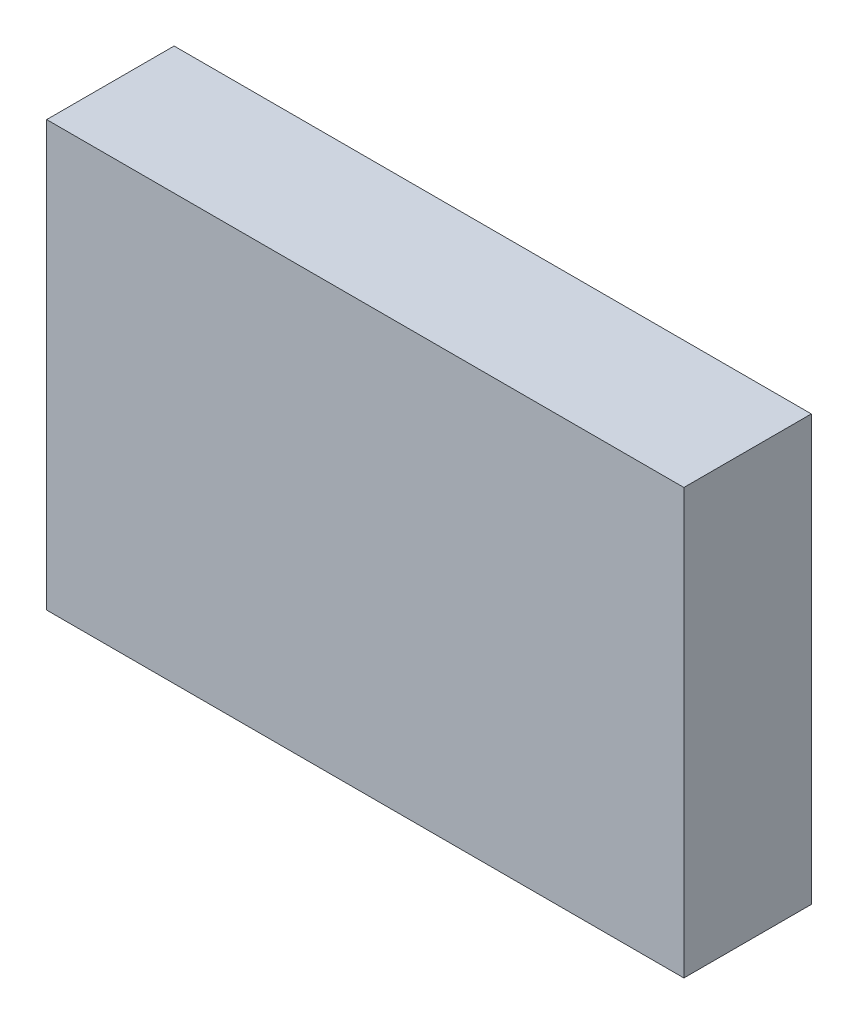
ISO-10303-21;
HEADER;
FILE_DESCRIPTION(('STEP AP214'),'2;1');
FILE_NAME('part.step','',(''),(''),'','','');
FILE_SCHEMA(('AUTOMOTIVE_DESIGN { 1 0 10303 214 1 1 1 1 }'));
ENDSEC;
DATA;
#1=APPLICATION_CONTEXT('core data for automotive mechanical design processes');
#2=APPLICATION_PROTOCOL_DEFINITION('international standard','automotive_design',2000,#1);
#3=PRODUCT_CONTEXT('',#1,'mechanical');
#4=PRODUCT('Part','Part','',(#3));
#5=PRODUCT_RELATED_PRODUCT_CATEGORY('part','',(#4));
#6=PRODUCT_DEFINITION_FORMATION('','',#4);
#7=PRODUCT_DEFINITION_CONTEXT('part definition',#1,'design');
#8=PRODUCT_DEFINITION('design','',#6,#7);
#9=PRODUCT_DEFINITION_SHAPE('','',#8);
#10=(LENGTH_UNIT() NAMED_UNIT(*) SI_UNIT(.MILLI.,.METRE.));
#11=(NAMED_UNIT(*) PLANE_ANGLE_UNIT() SI_UNIT($,.RADIAN.));
#12=(NAMED_UNIT(*) SI_UNIT($,.STERADIAN.) SOLID_ANGLE_UNIT());
#13=UNCERTAINTY_MEASURE_WITH_UNIT(LENGTH_MEASURE(1.E-05),#10,'distance_accuracy_value','');
#14=(GEOMETRIC_REPRESENTATION_CONTEXT(3) GLOBAL_UNCERTAINTY_ASSIGNED_CONTEXT((#13)) GLOBAL_UNIT_ASSIGNED_CONTEXT((#10,
#11,#12)) REPRESENTATION_CONTEXT('',''));
#15=CARTESIAN_POINT('',(0.,0.,0.));
#16=DIRECTION('',(0.,0.,1.));
#17=DIRECTION('',(1.,0.,0.));
#18=AXIS2_PLACEMENT_3D('',#15,#16,#17);
#19=CARTESIAN_POINT('',(23.4897837731481,6.69672301240758,-0.139997918412997));
#20=CARTESIAN_POINT('',(23.4897837731481,6.69672301240758,-0.859999526412997));
#21=CARTESIAN_POINT('',(23.4897837731481,9.09672126040757,-0.139997918412997));
#22=CARTESIAN_POINT('',(23.4897837731481,9.09672126040757,-0.859999526412997));
#23=(BOUNDED_SURFACE() B_SPLINE_SURFACE(1,1,((#19,#20),(#21,#22)),.UNSPECIFIED.,.F.,.F.,
.F.) B_SPLINE_SURFACE_WITH_KNOTS((2,2),(2,2),(-0.000199999853999999,0.00219999839399999),
(-0.000660001474,6.0000134E-05),
.UNSPECIFIED.) GEOMETRIC_REPRESENTATION_ITEM() RATIONAL_B_SPLINE_SURFACE(((1.,1.),(1.,1.))) REPRESENTATION_ITEM('') SURFACE());
#24=CARTESIAN_POINT('',(23.4897837731481,8.89672140640757,-0.799999392412997));
#25=CARTESIAN_POINT('',(23.4897837731481,6.89672286640758,-0.799999392412997));
#26=(BOUNDED_CURVE() B_SPLINE_CURVE(1,(#24,#25),.UNSPECIFIED.,.F.,
.F.) B_SPLINE_CURVE_WITH_KNOTS((2,2),(0.,0.00199999853999999),
.UNSPECIFIED.) CURVE() GEOMETRIC_REPRESENTATION_ITEM() RATIONAL_B_SPLINE_CURVE((1.,1.)) REPRESENTATION_ITEM(''));
#27=CARTESIAN_POINT('',(23.4897837731481,8.89672140640757,-0.799999392412997));
#28=VERTEX_POINT('',#27);
#29=CARTESIAN_POINT('',(23.4897837731481,6.89672286640758,-0.799999392412997));
#30=VERTEX_POINT('',#29);
#31=EDGE_CURVE('E87',#28,#30,#26,.T.);
#32=CARTESIAN_POINT('',(23.4897837731481,6.89672286640758,-0.799999392412997));
#33=CARTESIAN_POINT('',(23.4897837731481,6.89672286640758,-0.199998052412997));
#34=(BOUNDED_CURVE() B_SPLINE_CURVE(1,(#32,#33),.UNSPECIFIED.,.F.,
.F.) B_SPLINE_CURVE_WITH_KNOTS((2,2),(0.,0.00060000134),
.UNSPECIFIED.) CURVE() GEOMETRIC_REPRESENTATION_ITEM() RATIONAL_B_SPLINE_CURVE((1.,1.)) REPRESENTATION_ITEM(''));
#35=CARTESIAN_POINT('',(23.4897837731481,6.89672286640758,-0.199998052412997));
#36=VERTEX_POINT('',#35);
#37=EDGE_CURVE('E11',#30,#36,#34,.T.);
#38=CARTESIAN_POINT('',(23.4897837731481,8.89672140640757,-0.199998052412997));
#39=CARTESIAN_POINT('',(23.4897837731481,6.89672286640758,-0.199998052412997));
#40=(BOUNDED_CURVE() B_SPLINE_CURVE(1,(#38,#39),.UNSPECIFIED.,.F.,
.F.) B_SPLINE_CURVE_WITH_KNOTS((2,2),(0.,0.00199999853999999),
.UNSPECIFIED.) CURVE() GEOMETRIC_REPRESENTATION_ITEM() RATIONAL_B_SPLINE_CURVE((1.,1.)) REPRESENTATION_ITEM(''));
#41=CARTESIAN_POINT('',(23.4897837731481,8.89672140640757,-0.199998052412997));
#42=VERTEX_POINT('',#41);
#43=EDGE_CURVE('E23',#42,#36,#40,.T.);
#44=CARTESIAN_POINT('',(23.4897837731481,8.89672140640757,-0.799999392412997));
#45=CARTESIAN_POINT('',(23.4897837731481,8.89672140640757,-0.199998052412997));
#46=(BOUNDED_CURVE() B_SPLINE_CURVE(1,(#44,#45),.UNSPECIFIED.,.F.,
.F.) B_SPLINE_CURVE_WITH_KNOTS((2,2),(0.,0.00060000134),
.UNSPECIFIED.) CURVE() GEOMETRIC_REPRESENTATION_ITEM() RATIONAL_B_SPLINE_CURVE((1.,1.)) REPRESENTATION_ITEM(''));
#47=EDGE_CURVE('E105',#28,#42,#46,.T.);
#48=ORIENTED_EDGE('',*,*,#31,.T.);
#49=ORIENTED_EDGE('',*,*,#37,.T.);
#50=ORIENTED_EDGE('',*,*,#43,.F.);
#51=ORIENTED_EDGE('',*,*,#47,.F.);
#52=EDGE_LOOP('',(#48,#49,#50,#51));
#53=FACE_BOUND('',#52,.T.);
#54=ADVANCED_FACE('F17',(#53),#23,.T.);
#55=CARTESIAN_POINT('',(26.789782761148,6.89672286640758,-0.139997918412997));
#56=CARTESIAN_POINT('',(26.789782761148,6.89672286640758,-0.859999526412997));
#57=CARTESIAN_POINT('',(23.1897838651481,6.89672286640758,-0.139997918412997));
#58=CARTESIAN_POINT('',(23.1897838651481,6.89672286640758,-0.859999526412997));
#59=(BOUNDED_SURFACE() B_SPLINE_SURFACE(1,1,((#55,#56),(#57,#58)),.UNSPECIFIED.,.F.,.F.,
.F.) B_SPLINE_SURFACE_WITH_KNOTS((2,2),(2,2),(-0.00029999990799999,0.00329999898799988),
(-0.000660001474,6.0000134E-05),
.UNSPECIFIED.) GEOMETRIC_REPRESENTATION_ITEM() RATIONAL_B_SPLINE_SURFACE(((1.,1.),(1.,1.))) REPRESENTATION_ITEM('') SURFACE());
#60=CARTESIAN_POINT('',(23.4897837731481,6.89672286640758,-0.799999392412997));
#61=CARTESIAN_POINT('',(26.489782853148,6.89672286640758,-0.799999392412997));
#62=(BOUNDED_CURVE() B_SPLINE_CURVE(1,(#60,#61),.UNSPECIFIED.,.F.,
.F.) B_SPLINE_CURVE_WITH_KNOTS((2,2),(0.,0.0029999990799999),
.UNSPECIFIED.) CURVE() GEOMETRIC_REPRESENTATION_ITEM() RATIONAL_B_SPLINE_CURVE((1.,1.)) REPRESENTATION_ITEM(''));
#63=CARTESIAN_POINT('',(26.489782853148,6.89672286640758,-0.799999392412997));
#64=VERTEX_POINT('',#63);
#65=EDGE_CURVE('E61',#30,#64,#62,.T.);
#66=CARTESIAN_POINT('',(26.489782853148,6.89672286640758,-0.799999392412997));
#67=CARTESIAN_POINT('',(26.489782853148,6.89672286640758,-0.199998052412997));
#68=(BOUNDED_CURVE() B_SPLINE_CURVE(1,(#66,#67),.UNSPECIFIED.,.F.,
.F.) B_SPLINE_CURVE_WITH_KNOTS((2,2),(0.,0.00060000134),
.UNSPECIFIED.) CURVE() GEOMETRIC_REPRESENTATION_ITEM() RATIONAL_B_SPLINE_CURVE((1.,1.)) REPRESENTATION_ITEM(''));
#69=CARTESIAN_POINT('',(26.489782853148,6.89672286640758,-0.199998052412997));
#70=VERTEX_POINT('',#69);
#71=EDGE_CURVE('E32',#64,#70,#68,.T.);
#72=CARTESIAN_POINT('',(23.4897837731481,6.89672286640758,-0.199998052412997));
#73=CARTESIAN_POINT('',(26.489782853148,6.89672286640758,-0.199998052412997));
#74=(BOUNDED_CURVE() B_SPLINE_CURVE(1,(#72,#73),.UNSPECIFIED.,.F.,
.F.) B_SPLINE_CURVE_WITH_KNOTS((2,2),(0.,0.0029999990799999),
.UNSPECIFIED.) CURVE() GEOMETRIC_REPRESENTATION_ITEM() RATIONAL_B_SPLINE_CURVE((1.,1.)) REPRESENTATION_ITEM(''));
#75=EDGE_CURVE('E58',#36,#70,#74,.T.);
#76=ORIENTED_EDGE('',*,*,#65,.T.);
#77=ORIENTED_EDGE('',*,*,#71,.T.);
#78=ORIENTED_EDGE('',*,*,#75,.F.);
#79=ORIENTED_EDGE('',*,*,#37,.F.);
#80=EDGE_LOOP('',(#76,#77,#78,#79));
#81=FACE_BOUND('',#80,.T.);
#82=ADVANCED_FACE('F19',(#81),#59,.T.);
#83=CARTESIAN_POINT('',(26.489782853148,9.09672126040757,-0.139997918412997));
#84=CARTESIAN_POINT('',(26.489782853148,9.09672126040757,-0.859999526412997));
#85=CARTESIAN_POINT('',(26.489782853148,6.69672301240758,-0.139997918412997));
#86=CARTESIAN_POINT('',(26.489782853148,6.69672301240758,-0.859999526412997));
#87=(BOUNDED_SURFACE() B_SPLINE_SURFACE(1,1,((#83,#84),(#85,#86)),.UNSPECIFIED.,.F.,.F.,
.F.) B_SPLINE_SURFACE_WITH_KNOTS((2,2),(2,2),(-0.000199999853999999,0.00219999839399999),
(-0.000660001474,6.0000134E-05),
.UNSPECIFIED.) GEOMETRIC_REPRESENTATION_ITEM() RATIONAL_B_SPLINE_SURFACE(((1.,1.),(1.,1.))) REPRESENTATION_ITEM('') SURFACE());
#88=CARTESIAN_POINT('',(26.489782853148,6.89672286640758,-0.799999392412997));
#89=CARTESIAN_POINT('',(26.489782853148,8.89672140640757,-0.799999392412997));
#90=(BOUNDED_CURVE() B_SPLINE_CURVE(1,(#88,#89),.UNSPECIFIED.,.F.,
.F.) B_SPLINE_CURVE_WITH_KNOTS((2,2),(0.,0.00199999853999999),
.UNSPECIFIED.) CURVE() GEOMETRIC_REPRESENTATION_ITEM() RATIONAL_B_SPLINE_CURVE((1.,1.)) REPRESENTATION_ITEM(''));
#91=CARTESIAN_POINT('',(26.489782853148,8.89672140640757,-0.799999392412997));
#92=VERTEX_POINT('',#91);
#93=EDGE_CURVE('E113',#64,#92,#90,.T.);
#94=CARTESIAN_POINT('',(26.489782853148,8.89672140640757,-0.799999392412997));
#95=CARTESIAN_POINT('',(26.489782853148,8.89672140640757,-0.199998052412997));
#96=(BOUNDED_CURVE() B_SPLINE_CURVE(1,(#94,#95),.UNSPECIFIED.,.F.,
.F.) B_SPLINE_CURVE_WITH_KNOTS((2,2),(0.,0.00060000134),
.UNSPECIFIED.) CURVE() GEOMETRIC_REPRESENTATION_ITEM() RATIONAL_B_SPLINE_CURVE((1.,1.)) REPRESENTATION_ITEM(''));
#97=CARTESIAN_POINT('',(26.489782853148,8.89672140640757,-0.199998052412997));
#98=VERTEX_POINT('',#97);
#99=EDGE_CURVE('E66',#92,#98,#96,.T.);
#100=CARTESIAN_POINT('',(26.489782853148,6.89672286640758,-0.199998052412997));
#101=CARTESIAN_POINT('',(26.489782853148,8.89672140640757,-0.199998052412997));
#102=(BOUNDED_CURVE() B_SPLINE_CURVE(1,(#100,#101),.UNSPECIFIED.,.F.,
.F.) B_SPLINE_CURVE_WITH_KNOTS((2,2),(0.,0.00199999853999999),
.UNSPECIFIED.) CURVE() GEOMETRIC_REPRESENTATION_ITEM() RATIONAL_B_SPLINE_CURVE((1.,1.)) REPRESENTATION_ITEM(''));
#103=EDGE_CURVE('E68',#70,#98,#102,.T.);
#104=ORIENTED_EDGE('',*,*,#93,.T.);
#105=ORIENTED_EDGE('',*,*,#99,.T.);
#106=ORIENTED_EDGE('',*,*,#103,.F.);
#107=ORIENTED_EDGE('',*,*,#71,.F.);
#108=EDGE_LOOP('',(#104,#105,#106,#107));
#109=FACE_BOUND('',#108,.T.);
#110=ADVANCED_FACE('F69',(#109),#87,.T.);
#111=CARTESIAN_POINT('',(23.1897838651481,8.89672140640757,-0.139997918412997));
#112=CARTESIAN_POINT('',(23.1897838651481,8.89672140640757,-0.859999526412997));
#113=CARTESIAN_POINT('',(26.789782761148,8.89672140640757,-0.139997918412997));
#114=CARTESIAN_POINT('',(26.789782761148,8.89672140640757,-0.859999526412997));
#115=(BOUNDED_SURFACE() B_SPLINE_SURFACE(1,1,((#111,#112),(#113,#114)),.UNSPECIFIED.,.F.,.F.,
.F.) B_SPLINE_SURFACE_WITH_KNOTS((2,2),(2,2),(-0.00029999990799999,0.00329999898799988),
(-0.000660001474,6.0000134E-05),
.UNSPECIFIED.) GEOMETRIC_REPRESENTATION_ITEM() RATIONAL_B_SPLINE_SURFACE(((1.,1.),(1.,1.))) REPRESENTATION_ITEM('') SURFACE());
#116=CARTESIAN_POINT('',(26.489782853148,8.89672140640757,-0.799999392412997));
#117=CARTESIAN_POINT('',(23.4897837731481,8.89672140640757,-0.799999392412997));
#118=(BOUNDED_CURVE() B_SPLINE_CURVE(1,(#116,#117),.UNSPECIFIED.,.F.,
.F.) B_SPLINE_CURVE_WITH_KNOTS((2,2),(0.,0.0029999990799999),
.UNSPECIFIED.) CURVE() GEOMETRIC_REPRESENTATION_ITEM() RATIONAL_B_SPLINE_CURVE((1.,1.)) REPRESENTATION_ITEM(''));
#119=EDGE_CURVE('E114',#92,#28,#118,.T.);
#120=CARTESIAN_POINT('',(26.489782853148,8.89672140640757,-0.199998052412997));
#121=CARTESIAN_POINT('',(23.4897837731481,8.89672140640757,-0.199998052412997));
#122=(BOUNDED_CURVE() B_SPLINE_CURVE(1,(#120,#121),.UNSPECIFIED.,.F.,
.F.) B_SPLINE_CURVE_WITH_KNOTS((2,2),(0.,0.0029999990799999),
.UNSPECIFIED.) CURVE() GEOMETRIC_REPRESENTATION_ITEM() RATIONAL_B_SPLINE_CURVE((1.,1.)) REPRESENTATION_ITEM(''));
#123=EDGE_CURVE('E74',#98,#42,#122,.T.);
#124=ORIENTED_EDGE('',*,*,#119,.T.);
#125=ORIENTED_EDGE('',*,*,#47,.T.);
#126=ORIENTED_EDGE('',*,*,#123,.F.);
#127=ORIENTED_EDGE('',*,*,#99,.F.);
#128=EDGE_LOOP('',(#124,#125,#126,#127));
#129=FACE_BOUND('',#128,.T.);
#130=ADVANCED_FACE('F167',(#129),#115,.T.);
#131=CARTESIAN_POINT('',(26.789782761148,6.69672301240758,-0.799999392412997));
#132=CARTESIAN_POINT('',(26.789782761148,9.09672126040757,-0.799999392412997));
#133=CARTESIAN_POINT('',(23.1897838651481,6.69672301240758,-0.799999392412997));
#134=CARTESIAN_POINT('',(23.1897838651481,9.09672126040757,-0.799999392412997));
#135=(BOUNDED_SURFACE() B_SPLINE_SURFACE(1,1,((#131,#132),(#133,#134)),.UNSPECIFIED.,.F.,.F.,
.F.) B_SPLINE_SURFACE_WITH_KNOTS((2,2),(2,2),(-0.00329999898799988,0.000299999907999989),
(-0.00219999839399999,0.000199999853999999),
.UNSPECIFIED.) GEOMETRIC_REPRESENTATION_ITEM() RATIONAL_B_SPLINE_SURFACE(((1.,1.),(1.,1.))) REPRESENTATION_ITEM('') SURFACE());
#136=ORIENTED_EDGE('',*,*,#119,.F.);
#137=ORIENTED_EDGE('',*,*,#93,.F.);
#138=ORIENTED_EDGE('',*,*,#65,.F.);
#139=ORIENTED_EDGE('',*,*,#31,.F.);
#140=EDGE_LOOP('',(#136,#137,#138,#139));
#141=FACE_BOUND('',#140,.T.);
#142=ADVANCED_FACE('F166',(#141),#135,.T.);
#143=CARTESIAN_POINT('',(23.1897838651481,6.69672301240758,-0.199998052412997));
#144=CARTESIAN_POINT('',(23.1897838651481,9.09672126040757,-0.199998052412997));
#145=CARTESIAN_POINT('',(26.789782761148,6.69672301240758,-0.199998052412997));
#146=CARTESIAN_POINT('',(26.789782761148,9.09672126040757,-0.199998052412997));
#147=(BOUNDED_SURFACE() B_SPLINE_SURFACE(1,1,((#143,#144),(#145,#146)),.UNSPECIFIED.,.F.,.F.,
.F.) B_SPLINE_SURFACE_WITH_KNOTS((2,2),(2,2),(-0.00329999898799988,0.000299999907999989),
(-0.00219999839399999,0.000199999853999999),
.UNSPECIFIED.) GEOMETRIC_REPRESENTATION_ITEM() RATIONAL_B_SPLINE_SURFACE(((1.,1.),(1.,1.))) REPRESENTATION_ITEM('') SURFACE());
#148=ORIENTED_EDGE('',*,*,#43,.T.);
#149=ORIENTED_EDGE('',*,*,#75,.T.);
#150=ORIENTED_EDGE('',*,*,#103,.T.);
#151=ORIENTED_EDGE('',*,*,#123,.T.);
#152=EDGE_LOOP('',(#148,#149,#150,#151));
#153=FACE_BOUND('',#152,.T.);
#154=ADVANCED_FACE('F76',(#153),#147,.T.);
#155=CLOSED_SHELL('',(#54,#82,#110,#130,#142,#154));
#156=MANIFOLD_SOLID_BREP('B1',#155);
#157=ADVANCED_BREP_SHAPE_REPRESENTATION('',(#18,#156),#14);
#158=SHAPE_DEFINITION_REPRESENTATION(#9,#157);
ENDSEC;
END-ISO-10303-21;
